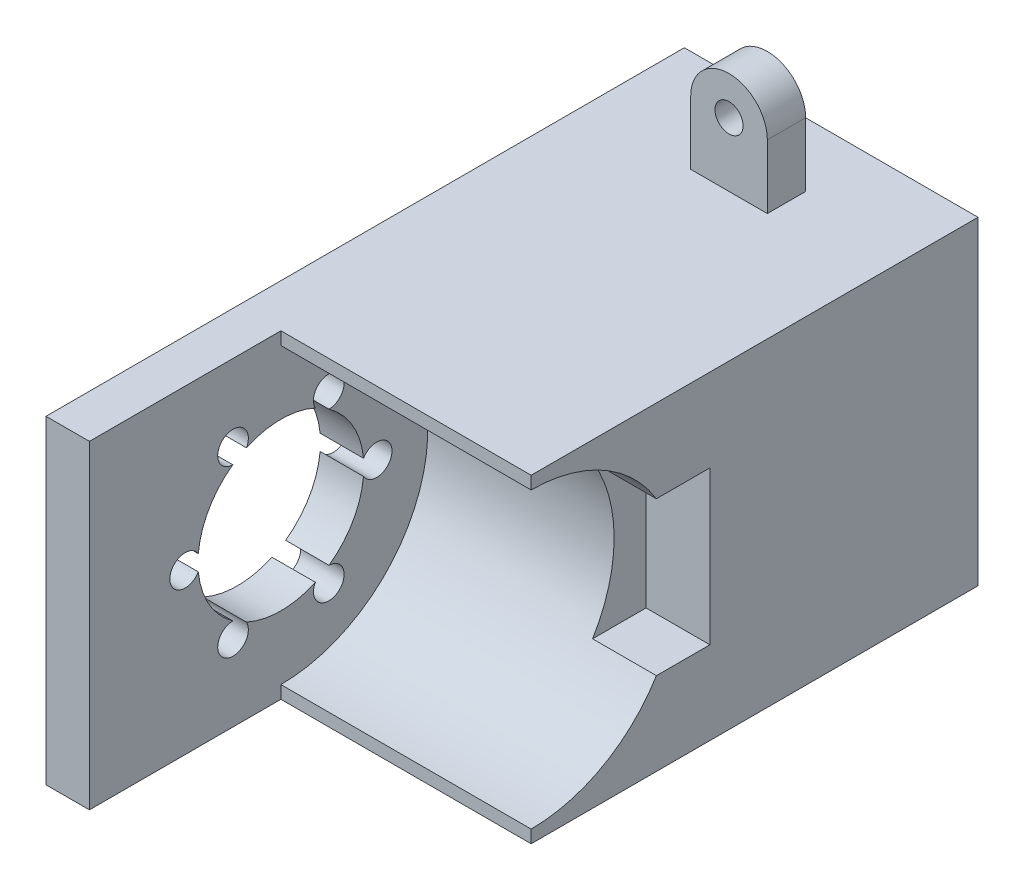
ISO-10303-21;
HEADER;
FILE_DESCRIPTION(('STEP AP214'),'2;1');
FILE_NAME('part.step','',(''),(''),'','','');
FILE_SCHEMA(('AUTOMOTIVE_DESIGN { 1 0 10303 214 1 1 1 1 }'));
ENDSEC;
DATA;
#1=APPLICATION_CONTEXT('core data for automotive mechanical design processes');
#2=APPLICATION_PROTOCOL_DEFINITION('international standard','automotive_design',2000,#1);
#3=PRODUCT_CONTEXT('',#1,'mechanical');
#4=PRODUCT('Part','Part','',(#3));
#5=PRODUCT_RELATED_PRODUCT_CATEGORY('part','',(#4));
#6=PRODUCT_DEFINITION_FORMATION('','',#4);
#7=PRODUCT_DEFINITION_CONTEXT('part definition',#1,'design');
#8=PRODUCT_DEFINITION('design','',#6,#7);
#9=PRODUCT_DEFINITION_SHAPE('','',#8);
#10=(LENGTH_UNIT() NAMED_UNIT(*) SI_UNIT(.MILLI.,.METRE.));
#11=(NAMED_UNIT(*) PLANE_ANGLE_UNIT() SI_UNIT($,.RADIAN.));
#12=(NAMED_UNIT(*) SI_UNIT($,.STERADIAN.) SOLID_ANGLE_UNIT());
#13=UNCERTAINTY_MEASURE_WITH_UNIT(LENGTH_MEASURE(1.E-05),#10,'distance_accuracy_value','');
#14=(GEOMETRIC_REPRESENTATION_CONTEXT(3) GLOBAL_UNCERTAINTY_ASSIGNED_CONTEXT((#13)) GLOBAL_UNIT_ASSIGNED_CONTEXT((#10,
#11,#12)) REPRESENTATION_CONTEXT('',''));
#15=CARTESIAN_POINT('',(0.,0.,0.));
#16=DIRECTION('',(0.,0.,1.));
#17=DIRECTION('',(1.,0.,0.));
#18=AXIS2_PLACEMENT_3D('',#15,#16,#17);
#19=CARTESIAN_POINT('',(-3.,-17.5,-27.));
#20=DIRECTION('',(-1.,0.,0.));
#21=DIRECTION('',(0.,0.,1.));
#22=AXIS2_PLACEMENT_3D('',#19,#20,#21);
#23=PLANE('',#22);
#24=DIRECTION('',(0.,0.,-1.));
#25=VECTOR('',#24,1.);
#26=CARTESIAN_POINT('',(-3.,-12.5,-27.));
#27=LINE('',#26,#25);
#28=CARTESIAN_POINT('',(-3.,-12.5,-27.));
#29=VERTEX_POINT('',#28);
#30=CARTESIAN_POINT('',(-3.,-12.5,-30.));
#31=VERTEX_POINT('',#30);
#32=EDGE_CURVE('E677',#29,#31,#27,.T.);
#33=ORIENTED_EDGE('',*,*,#32,.T.);
#34=DIRECTION('',(0.,1.,0.));
#35=VECTOR('',#34,1.);
#36=CARTESIAN_POINT('',(-3.,-17.5,-30.));
#37=LINE('',#36,#35);
#38=CARTESIAN_POINT('',(-3.,-17.5,-30.));
#39=VERTEX_POINT('',#38);
#40=EDGE_CURVE('E713',#39,#31,#37,.T.);
#41=ORIENTED_EDGE('',*,*,#40,.F.);
#42=DIRECTION('',(0.,0.,-1.));
#43=VECTOR('',#42,1.);
#44=CARTESIAN_POINT('',(-3.,-17.5,-27.));
#45=LINE('',#44,#43);
#46=CARTESIAN_POINT('',(-3.,-17.5,-27.));
#47=VERTEX_POINT('',#46);
#48=EDGE_CURVE('E673',#47,#39,#45,.T.);
#49=ORIENTED_EDGE('',*,*,#48,.F.);
#50=DIRECTION('',(0.,1.,0.));
#51=VECTOR('',#50,1.);
#52=CARTESIAN_POINT('',(-3.,-17.5,-27.));
#53=LINE('',#52,#51);
#54=EDGE_CURVE('E663',#47,#29,#53,.T.);
#55=ORIENTED_EDGE('',*,*,#54,.T.);
#56=EDGE_LOOP('',(#33,#41,#49,#55));
#57=FACE_BOUND('',#56,.T.);
#58=ADVANCED_FACE('F95',(#57),#23,.T.);
#59=CARTESIAN_POINT('',(0.,-17.5,-27.));
#60=DIRECTION('',(0.,0.,-1.));
#61=DIRECTION('',(-1.,0.,0.));
#62=AXIS2_PLACEMENT_3D('',#59,#60,#61);
#63=CYLINDRICAL_SURFACE('',#62,3.);
#64=ORIENTED_EDGE('',*,*,#48,.T.);
#65=CARTESIAN_POINT('',(0.,-17.5,-30.));
#66=DIRECTION('',(0.,0.,-1.));
#67=DIRECTION('',(-1.,0.,0.));
#68=AXIS2_PLACEMENT_3D('',#65,#66,#67);
#69=CIRCLE('',#68,3.);
#70=CARTESIAN_POINT('',(3.,-17.5,-30.));
#71=VERTEX_POINT('',#70);
#72=EDGE_CURVE('E706',#71,#39,#69,.T.);
#73=ORIENTED_EDGE('',*,*,#72,.F.);
#74=DIRECTION('',(0.,0.,-1.));
#75=VECTOR('',#74,1.);
#76=CARTESIAN_POINT('',(3.,-17.5,-27.));
#77=LINE('',#76,#75);
#78=CARTESIAN_POINT('',(3.,-17.5,-27.));
#79=VERTEX_POINT('',#78);
#80=EDGE_CURVE('E675',#79,#71,#77,.T.);
#81=ORIENTED_EDGE('',*,*,#80,.F.);
#82=CARTESIAN_POINT('',(0.,-17.5,-27.));
#83=DIRECTION('',(0.,0.,-1.));
#84=DIRECTION('',(-1.,0.,0.));
#85=AXIS2_PLACEMENT_3D('',#82,#83,#84);
#86=CIRCLE('',#85,3.);
#87=EDGE_CURVE('E666',#79,#47,#86,.T.);
#88=ORIENTED_EDGE('',*,*,#87,.T.);
#89=EDGE_LOOP('',(#64,#73,#81,#88));
#90=FACE_BOUND('',#89,.T.);
#91=ADVANCED_FACE('F553',(#90),#63,.T.);
#92=CARTESIAN_POINT('',(3.,-17.5,-27.));
#93=DIRECTION('',(1.,0.,0.));
#94=DIRECTION('',(0.,1.,0.));
#95=AXIS2_PLACEMENT_3D('',#92,#93,#94);
#96=PLANE('',#95);
#97=ORIENTED_EDGE('',*,*,#80,.T.);
#98=DIRECTION('',(0.,-1.,0.));
#99=VECTOR('',#98,1.);
#100=CARTESIAN_POINT('',(3.,-17.5,-30.));
#101=LINE('',#100,#99);
#102=CARTESIAN_POINT('',(3.,-12.5,-30.));
#103=VERTEX_POINT('',#102);
#104=EDGE_CURVE('E716',#103,#71,#101,.T.);
#105=ORIENTED_EDGE('',*,*,#104,.F.);
#106=DIRECTION('',(0.,0.,-1.));
#107=VECTOR('',#106,1.);
#108=CARTESIAN_POINT('',(3.,-12.5,-27.));
#109=LINE('',#108,#107);
#110=CARTESIAN_POINT('',(3.,-12.5,-27.));
#111=VERTEX_POINT('',#110);
#112=EDGE_CURVE('E680',#111,#103,#109,.T.);
#113=ORIENTED_EDGE('',*,*,#112,.F.);
#114=DIRECTION('',(0.,-1.,0.));
#115=VECTOR('',#114,1.);
#116=CARTESIAN_POINT('',(3.,-17.5,-27.));
#117=LINE('',#116,#115);
#118=EDGE_CURVE('E678',#111,#79,#117,.T.);
#119=ORIENTED_EDGE('',*,*,#118,.T.);
#120=EDGE_LOOP('',(#97,#105,#113,#119));
#121=FACE_BOUND('',#120,.T.);
#122=ADVANCED_FACE('F559',(#121),#96,.T.);
#123=CARTESIAN_POINT('',(0.,-17.5,-27.));
#124=DIRECTION('',(0.,0.,-1.));
#125=DIRECTION('',(-1.,0.,0.));
#126=AXIS2_PLACEMENT_3D('',#123,#124,#125);
#127=CYLINDRICAL_SURFACE('',#126,1.1);
#128=CARTESIAN_POINT('',(0.,-17.5,-27.));
#129=DIRECTION('',(0.,0.,-1.));
#130=DIRECTION('',(-1.,0.,0.));
#131=AXIS2_PLACEMENT_3D('',#128,#129,#130);
#132=CIRCLE('',#131,1.1);
#133=CARTESIAN_POINT('',(-1.1,-17.5,-27.));
#134=VERTEX_POINT('',#133);
#135=EDGE_CURVE('E659',#134,#134,#132,.T.);
#136=ORIENTED_EDGE('',*,*,#135,.F.);
#137=EDGE_LOOP('',(#136));
#138=FACE_BOUND('',#137,.T.);
#139=CARTESIAN_POINT('',(0.,-17.5,-30.));
#140=DIRECTION('',(0.,0.,-1.));
#141=DIRECTION('',(-1.,0.,0.));
#142=AXIS2_PLACEMENT_3D('',#139,#140,#141);
#143=CIRCLE('',#142,1.1);
#144=CARTESIAN_POINT('',(-1.1,-17.5,-30.));
#145=VERTEX_POINT('',#144);
#146=EDGE_CURVE('E710',#145,#145,#143,.T.);
#147=ORIENTED_EDGE('',*,*,#146,.T.);
#148=EDGE_LOOP('',(#147));
#149=FACE_BOUND('',#148,.T.);
#150=ADVANCED_FACE('F635',(#138,#149),#127,.F.);
#151=CARTESIAN_POINT('',(0.,12.5,-35.));
#152=DIRECTION('',(0.,-1.,0.));
#153=DIRECTION('',(0.,0.,-1.));
#154=AXIS2_PLACEMENT_3D('',#151,#152,#153);
#155=PLANE('',#154);
#156=DIRECTION('',(0.,0.,1.));
#157=VECTOR('',#156,1.);
#158=CARTESIAN_POINT('',(11.5,12.5,-35.));
#159=LINE('',#158,#157);
#160=CARTESIAN_POINT('',(11.5,12.5,-35.));
#161=VERTEX_POINT('',#160);
#162=CARTESIAN_POINT('',(11.5,12.5,0.));
#163=VERTEX_POINT('',#162);
#164=EDGE_CURVE('E461',#161,#163,#159,.T.);
#165=ORIENTED_EDGE('',*,*,#164,.F.);
#166=DIRECTION('',(1.,0.,0.));
#167=VECTOR('',#166,1.);
#168=CARTESIAN_POINT('',(0.,12.5,-35.));
#169=LINE('',#168,#167);
#170=CARTESIAN_POINT('',(-11.5,12.5,-35.));
#171=VERTEX_POINT('',#170);
#172=EDGE_CURVE('E453',#171,#161,#169,.T.);
#173=ORIENTED_EDGE('',*,*,#172,.F.);
#174=DIRECTION('',(0.,0.,1.));
#175=VECTOR('',#174,1.);
#176=CARTESIAN_POINT('',(-11.5,12.5,-35.));
#177=LINE('',#176,#175);
#178=CARTESIAN_POINT('',(-11.5,12.5,15.));
#179=VERTEX_POINT('',#178);
#180=EDGE_CURVE('E474',#171,#179,#177,.T.);
#181=ORIENTED_EDGE('',*,*,#180,.T.);
#182=DIRECTION('',(-1.,0.,0.));
#183=VECTOR('',#182,1.);
#184=CARTESIAN_POINT('',(-11.5,12.5,15.));
#185=LINE('',#184,#183);
#186=CARTESIAN_POINT('',(-8.10000000000001,12.5,15.));
#187=VERTEX_POINT('',#186);
#188=EDGE_CURVE('E423',#187,#179,#185,.T.);
#189=ORIENTED_EDGE('',*,*,#188,.F.);
#190=DIRECTION('',(0.,0.,-1.));
#191=VECTOR('',#190,1.);
#192=CARTESIAN_POINT('',(-8.10000000000001,12.5,15.));
#193=LINE('',#192,#191);
#194=CARTESIAN_POINT('',(-8.1,12.5,0.));
#195=VERTEX_POINT('',#194);
#196=EDGE_CURVE('E434',#187,#195,#193,.T.);
#197=ORIENTED_EDGE('',*,*,#196,.T.);
#198=DIRECTION('',(1.,0.,0.));
#199=VECTOR('',#198,1.);
#200=CARTESIAN_POINT('',(0.,12.5,0.));
#201=LINE('',#200,#199);
#202=EDGE_CURVE('E465',#195,#163,#201,.T.);
#203=ORIENTED_EDGE('',*,*,#202,.T.);
#204=EDGE_LOOP('',(#165,#173,#181,#189,#197,#203));
#205=FACE_BOUND('',#204,.T.);
#206=DIRECTION('',(0.,0.,-1.));
#207=VECTOR('',#206,1.);
#208=CARTESIAN_POINT('',(3.,12.5,-27.));
#209=LINE('',#208,#207);
#210=CARTESIAN_POINT('',(3.,12.5,-27.));
#211=VERTEX_POINT('',#210);
#212=CARTESIAN_POINT('',(3.,12.5,-30.));
#213=VERTEX_POINT('',#212);
#214=EDGE_CURVE('E308',#211,#213,#209,.T.);
#215=ORIENTED_EDGE('',*,*,#214,.F.);
#216=DIRECTION('',(-1.,0.,0.));
#217=VECTOR('',#216,1.);
#218=CARTESIAN_POINT('',(3.,12.5,-27.));
#219=LINE('',#218,#217);
#220=CARTESIAN_POINT('',(-3.,12.5,-27.));
#221=VERTEX_POINT('',#220);
#222=EDGE_CURVE('E696',#211,#221,#219,.T.);
#223=ORIENTED_EDGE('',*,*,#222,.T.);
#224=DIRECTION('',(0.,0.,-1.));
#225=VECTOR('',#224,1.);
#226=CARTESIAN_POINT('',(-3.,12.5,-27.));
#227=LINE('',#226,#225);
#228=CARTESIAN_POINT('',(-3.,12.5,-30.));
#229=VERTEX_POINT('',#228);
#230=EDGE_CURVE('E309',#221,#229,#227,.T.);
#231=ORIENTED_EDGE('',*,*,#230,.T.);
#232=DIRECTION('',(-1.,0.,0.));
#233=VECTOR('',#232,1.);
#234=CARTESIAN_POINT('',(3.,12.5,-30.));
#235=LINE('',#234,#233);
#236=EDGE_CURVE('E304',#213,#229,#235,.T.);
#237=ORIENTED_EDGE('',*,*,#236,.F.);
#238=EDGE_LOOP('',(#215,#223,#231,#237));
#239=FACE_BOUND('',#238,.T.);
#240=ADVANCED_FACE('F305',(#205,#239),#155,.F.);
#241=CARTESIAN_POINT('',(0.,0.,0.));
#242=DIRECTION('',(0.,0.,1.));
#243=DIRECTION('',(1.,0.,0.));
#244=AXIS2_PLACEMENT_3D('',#241,#242,#243);
#245=PLANE('',#244);
#246=ORIENTED_EDGE('',*,*,#202,.F.);
#247=DIRECTION('',(0.,1.,0.));
#248=VECTOR('',#247,1.);
#249=CARTESIAN_POINT('',(-8.10000000000001,12.5,0.));
#250=LINE('',#249,#248);
#251=CARTESIAN_POINT('',(-8.10000000000001,11.5,0.));
#252=VERTEX_POINT('',#251);
#253=EDGE_CURVE('E422',#252,#195,#250,.T.);
#254=ORIENTED_EDGE('',*,*,#253,.F.);
#255=DIRECTION('',(1.,0.,0.));
#256=VECTOR('',#255,1.);
#257=CARTESIAN_POINT('',(11.5,11.5,0.));
#258=LINE('',#257,#256);
#259=CARTESIAN_POINT('',(11.5,11.5,0.));
#260=VERTEX_POINT('',#259);
#261=EDGE_CURVE('E471',#252,#260,#258,.T.);
#262=ORIENTED_EDGE('',*,*,#261,.T.);
#263=DIRECTION('',(0.,-1.,0.));
#264=VECTOR('',#263,1.);
#265=CARTESIAN_POINT('',(11.5,0.,0.));
#266=LINE('',#265,#264);
#267=EDGE_CURVE('E462',#163,#260,#266,.T.);
#268=ORIENTED_EDGE('',*,*,#267,.F.);
#269=EDGE_LOOP('',(#246,#254,#262,#268));
#270=FACE_BOUND('',#269,.T.);
#271=ADVANCED_FACE('F510',(#270),#245,.T.);
#272=DIRECTION('',(1.,0.,0.));
#273=VECTOR('',#272,1.);
#274=CARTESIAN_POINT('',(11.5,-11.5,0.));
#275=LINE('',#274,#273);
#276=CARTESIAN_POINT('',(11.5,-11.5,0.));
#277=VERTEX_POINT('',#276);
#278=CARTESIAN_POINT('',(-8.1,-11.5,0.));
#279=VERTEX_POINT('',#278);
#280=EDGE_CURVE('E480',#277,#279,#275,.F.);
#281=ORIENTED_EDGE('',*,*,#280,.T.);
#282=CARTESIAN_POINT('',(-8.1,-12.5,0.));
#283=VERTEX_POINT('',#282);
#284=EDGE_CURVE('E427',#283,#279,#250,.T.);
#285=ORIENTED_EDGE('',*,*,#284,.F.);
#286=DIRECTION('',(1.,0.,0.));
#287=VECTOR('',#286,1.);
#288=CARTESIAN_POINT('',(0.,-12.5,0.));
#289=LINE('',#288,#287);
#290=CARTESIAN_POINT('',(11.5,-12.5,0.));
#291=VERTEX_POINT('',#290);
#292=EDGE_CURVE('E454',#283,#291,#289,.T.);
#293=ORIENTED_EDGE('',*,*,#292,.T.);
#294=EDGE_CURVE('E449',#277,#291,#266,.T.);
#295=ORIENTED_EDGE('',*,*,#294,.F.);
#296=EDGE_LOOP('',(#281,#285,#293,#295));
#297=FACE_BOUND('',#296,.T.);
#298=ADVANCED_FACE('F533',(#297),#245,.T.);
#299=CARTESIAN_POINT('',(11.5,0.,-35.));
#300=DIRECTION('',(-1.,0.,0.));
#301=DIRECTION('',(0.,0.,1.));
#302=AXIS2_PLACEMENT_3D('',#299,#300,#301);
#303=PLANE('',#302);
#304=DIRECTION('',(0.,1.,0.));
#305=VECTOR('',#304,1.);
#306=CARTESIAN_POINT('',(11.5,-6.,-14.));
#307=LINE('',#306,#305);
#308=CARTESIAN_POINT('',(11.5,-6.,-14.));
#309=VERTEX_POINT('',#308);
#310=CARTESIAN_POINT('',(11.5,6.,-14.));
#311=VERTEX_POINT('',#310);
#312=EDGE_CURVE('E339',#309,#311,#307,.T.);
#313=ORIENTED_EDGE('',*,*,#312,.F.);
#314=DIRECTION('',(0.,0.,-1.));
#315=VECTOR('',#314,1.);
#316=CARTESIAN_POINT('',(11.5,-6.,-8.99999999999999));
#317=LINE('',#316,#315);
#318=CARTESIAN_POINT('',(11.5,-6.,-9.81070843517429));
#319=VERTEX_POINT('',#318);
#320=EDGE_CURVE('E334',#319,#309,#317,.T.);
#321=ORIENTED_EDGE('',*,*,#320,.F.);
#322=CARTESIAN_POINT('',(11.5,0.,0.));
#323=DIRECTION('',(1.,0.,0.));
#324=DIRECTION('',(0.,0.,-1.));
#325=AXIS2_PLACEMENT_3D('',#322,#323,#324);
#326=CIRCLE('',#325,11.5);
#327=EDGE_CURVE('E446',#277,#319,#326,.T.);
#328=ORIENTED_EDGE('',*,*,#327,.F.);
#329=ORIENTED_EDGE('',*,*,#294,.T.);
#330=DIRECTION('',(0.,0.,1.));
#331=VECTOR('',#330,1.);
#332=CARTESIAN_POINT('',(11.5,-12.5,-35.));
#333=LINE('',#332,#331);
#334=CARTESIAN_POINT('',(11.5,-12.5,-35.));
#335=VERTEX_POINT('',#334);
#336=EDGE_CURVE('E468',#335,#291,#333,.T.);
#337=ORIENTED_EDGE('',*,*,#336,.F.);
#338=DIRECTION('',(0.,-1.,0.));
#339=VECTOR('',#338,1.);
#340=CARTESIAN_POINT('',(11.5,0.,-35.));
#341=LINE('',#340,#339);
#342=EDGE_CURVE('E450',#161,#335,#341,.T.);
#343=ORIENTED_EDGE('',*,*,#342,.F.);
#344=ORIENTED_EDGE('',*,*,#164,.T.);
#345=ORIENTED_EDGE('',*,*,#267,.T.);
#346=CARTESIAN_POINT('',(11.5,6.,-9.81070843517429));
#347=VERTEX_POINT('',#346);
#348=EDGE_CURVE('E445',#347,#260,#326,.T.);
#349=ORIENTED_EDGE('',*,*,#348,.F.);
#350=DIRECTION('',(0.,0.,1.));
#351=VECTOR('',#350,1.);
#352=CARTESIAN_POINT('',(11.5,6.,-9.));
#353=LINE('',#352,#351);
#354=EDGE_CURVE('E342',#311,#347,#353,.T.);
#355=ORIENTED_EDGE('',*,*,#354,.F.);
#356=EDGE_LOOP('',(#313,#321,#328,#329,#337,#343,#344,#345,#349,#355));
#357=FACE_BOUND('',#356,.T.);
#358=ADVANCED_FACE('F97',(#357),#303,.F.);
#359=CARTESIAN_POINT('',(0.,-12.5,-35.));
#360=DIRECTION('',(0.,-1.,0.));
#361=DIRECTION('',(0.,0.,-1.));
#362=AXIS2_PLACEMENT_3D('',#359,#360,#361);
#363=PLANE('',#362);
#364=DIRECTION('',(1.,0.,0.));
#365=VECTOR('',#364,1.);
#366=CARTESIAN_POINT('',(0.,-12.5,-35.));
#367=LINE('',#366,#365);
#368=CARTESIAN_POINT('',(-11.5,-12.5,-35.));
#369=VERTEX_POINT('',#368);
#370=EDGE_CURVE('E459',#369,#335,#367,.T.);
#371=ORIENTED_EDGE('',*,*,#370,.T.);
#372=ORIENTED_EDGE('',*,*,#336,.T.);
#373=ORIENTED_EDGE('',*,*,#292,.F.);
#374=DIRECTION('',(0.,0.,-1.));
#375=VECTOR('',#374,1.);
#376=CARTESIAN_POINT('',(-8.1,-12.5,15.));
#377=LINE('',#376,#375);
#378=CARTESIAN_POINT('',(-8.1,-12.5,15.));
#379=VERTEX_POINT('',#378);
#380=EDGE_CURVE('E439',#379,#283,#377,.T.);
#381=ORIENTED_EDGE('',*,*,#380,.F.);
#382=DIRECTION('',(1.,0.,0.));
#383=VECTOR('',#382,1.);
#384=CARTESIAN_POINT('',(-8.1,-12.5,15.));
#385=LINE('',#384,#383);
#386=CARTESIAN_POINT('',(-11.5,-12.5,15.));
#387=VERTEX_POINT('',#386);
#388=EDGE_CURVE('E430',#387,#379,#385,.T.);
#389=ORIENTED_EDGE('',*,*,#388,.F.);
#390=DIRECTION('',(0.,0.,1.));
#391=VECTOR('',#390,1.);
#392=CARTESIAN_POINT('',(-11.5,-12.5,-35.));
#393=LINE('',#392,#391);
#394=EDGE_CURVE('E472',#369,#387,#393,.T.);
#395=ORIENTED_EDGE('',*,*,#394,.F.);
#396=EDGE_LOOP('',(#371,#372,#373,#381,#389,#395));
#397=FACE_BOUND('',#396,.T.);
#398=ORIENTED_EDGE('',*,*,#32,.F.);
#399=DIRECTION('',(1.,0.,0.));
#400=VECTOR('',#399,1.);
#401=CARTESIAN_POINT('',(3.,-12.5,-27.));
#402=LINE('',#401,#400);
#403=EDGE_CURVE('E668',#29,#111,#402,.T.);
#404=ORIENTED_EDGE('',*,*,#403,.T.);
#405=ORIENTED_EDGE('',*,*,#112,.T.);
#406=DIRECTION('',(1.,0.,0.));
#407=VECTOR('',#406,1.);
#408=CARTESIAN_POINT('',(3.,-12.5,-30.));
#409=LINE('',#408,#407);
#410=EDGE_CURVE('E118',#31,#103,#409,.T.);
#411=ORIENTED_EDGE('',*,*,#410,.F.);
#412=EDGE_LOOP('',(#398,#404,#405,#411));
#413=FACE_BOUND('',#412,.T.);
#414=ADVANCED_FACE('F527',(#397,#413),#363,.T.);
#415=CARTESIAN_POINT('',(-11.5,0.,-35.));
#416=DIRECTION('',(-1.,0.,0.));
#417=DIRECTION('',(0.,0.,1.));
#418=AXIS2_PLACEMENT_3D('',#415,#416,#417);
#419=PLANE('',#418);
#420=CARTESIAN_POINT('',(-11.5,0.,0.));
#421=DIRECTION('',(-1.,0.,0.));
#422=DIRECTION('',(0.,0.,1.));
#423=AXIS2_PLACEMENT_3D('',#420,#421,#422);
#424=CIRCLE('',#423,6.5);
#425=CARTESIAN_POINT('',(-11.5,0.616824844578213,6.47066666666666));
#426=VERTEX_POINT('',#425);
#427=CARTESIAN_POINT('',(-11.5,5.29534929046546,3.76951931842337));
#428=VERTEX_POINT('',#427);
#429=EDGE_CURVE('E403',#426,#428,#424,.T.);
#430=ORIENTED_EDGE('',*,*,#429,.F.);
#431=CARTESIAN_POINT('',(-11.5,0.,7.5));
#432=DIRECTION('',(-1.,0.,0.));
#433=DIRECTION('',(0.,0.,1.));
#434=AXIS2_PLACEMENT_3D('',#431,#432,#433);
#435=CIRCLE('',#434,1.2);
#436=CARTESIAN_POINT('',(-11.5,-0.616824844578123,6.47066666666667));
#437=VERTEX_POINT('',#436);
#438=EDGE_CURVE('E409',#437,#426,#435,.T.);
#439=ORIENTED_EDGE('',*,*,#438,.F.);
#440=CARTESIAN_POINT('',(-11.5,0.,0.));
#441=DIRECTION('',(-1.,0.,0.));
#442=DIRECTION('',(0.,0.,1.));
#443=AXIS2_PLACEMENT_3D('',#440,#441,#442);
#444=CIRCLE('',#443,6.5);
#445=CARTESIAN_POINT('',(-11.5,-5.29534929046541,3.76951931842344));
#446=VERTEX_POINT('',#445);
#447=EDGE_CURVE('E405',#446,#437,#444,.T.);
#448=ORIENTED_EDGE('',*,*,#447,.F.);
#449=CARTESIAN_POINT('',(-11.5,-6.49519052838327,3.75000000000003));
#450=DIRECTION('',(-1.,0.,0.));
#451=DIRECTION('',(0.,0.,1.));
#452=AXIS2_PLACEMENT_3D('',#449,#450,#451);
#453=CIRCLE('',#452,1.2);
#454=CARTESIAN_POINT('',(-11.5,-5.91217413504358,2.70114734824327));
#455=VERTEX_POINT('',#454);
#456=EDGE_CURVE('E418',#455,#446,#453,.T.);
#457=ORIENTED_EDGE('',*,*,#456,.F.);
#458=CARTESIAN_POINT('',(-11.5,0.,0.));
#459=DIRECTION('',(-1.,0.,0.));
#460=DIRECTION('',(0.,0.,1.));
#461=AXIS2_PLACEMENT_3D('',#458,#459,#460);
#462=CIRCLE('',#461,6.5);
#463=CARTESIAN_POINT('',(-11.5,-5.91217413504364,-2.70114734824315));
#464=VERTEX_POINT('',#463);
#465=EDGE_CURVE('E407',#464,#455,#462,.T.);
#466=ORIENTED_EDGE('',*,*,#465,.F.);
#467=CARTESIAN_POINT('',(-11.5,-6.49519052838335,-3.74999999999989));
#468=DIRECTION('',(-1.,0.,0.));
#469=DIRECTION('',(0.,0.,1.));
#470=AXIS2_PLACEMENT_3D('',#467,#468,#469);
#471=CIRCLE('',#470,1.2);
#472=CARTESIAN_POINT('',(-11.5,-5.29534929046548,-3.76951931842333));
#473=VERTEX_POINT('',#472);
#474=EDGE_CURVE('E413',#473,#464,#471,.T.);
#475=ORIENTED_EDGE('',*,*,#474,.F.);
#476=CARTESIAN_POINT('',(-11.5,0.,0.));
#477=DIRECTION('',(-1.,0.,0.));
#478=DIRECTION('',(0.,0.,1.));
#479=AXIS2_PLACEMENT_3D('',#476,#477,#478);
#480=CIRCLE('',#479,6.5);
#481=CARTESIAN_POINT('',(-11.5,-0.616824844578176,-6.47066666666667));
#482=VERTEX_POINT('',#481);
#483=EDGE_CURVE('E357',#482,#473,#480,.T.);
#484=ORIENTED_EDGE('',*,*,#483,.F.);
#485=CARTESIAN_POINT('',(-11.5,0.,-7.5));
#486=DIRECTION('',(-1.,0.,0.));
#487=DIRECTION('',(0.,0.,1.));
#488=AXIS2_PLACEMENT_3D('',#485,#486,#487);
#489=CIRCLE('',#488,1.2);
#490=CARTESIAN_POINT('',(-11.5,0.616824844578176,-6.47066666666667));
#491=VERTEX_POINT('',#490);
#492=EDGE_CURVE('E415',#491,#482,#489,.T.);
#493=ORIENTED_EDGE('',*,*,#492,.F.);
#494=CARTESIAN_POINT('',(-11.5,0.,0.));
#495=DIRECTION('',(-1.,0.,0.));
#496=DIRECTION('',(0.,0.,1.));
#497=AXIS2_PLACEMENT_3D('',#494,#495,#496);
#498=CIRCLE('',#497,6.5);
#499=CARTESIAN_POINT('',(-11.5,5.29534929046538,-3.76951931842348));
#500=VERTEX_POINT('',#499);
#501=EDGE_CURVE('E399',#500,#491,#498,.T.);
#502=ORIENTED_EDGE('',*,*,#501,.F.);
#503=CARTESIAN_POINT('',(-11.5,6.49519052838325,-3.75000000000008));
#504=DIRECTION('',(-1.,0.,0.));
#505=DIRECTION('',(0.,0.,1.));
#506=AXIS2_PLACEMENT_3D('',#503,#504,#505);
#507=CIRCLE('',#506,1.2);
#508=CARTESIAN_POINT('',(-11.5,5.91217413504356,-2.70114734824332));
#509=VERTEX_POINT('',#508);
#510=EDGE_CURVE('E411',#509,#500,#507,.T.);
#511=ORIENTED_EDGE('',*,*,#510,.F.);
#512=CARTESIAN_POINT('',(-11.5,0.,0.));
#513=DIRECTION('',(-1.,0.,0.));
#514=DIRECTION('',(0.,0.,1.));
#515=AXIS2_PLACEMENT_3D('',#512,#513,#514);
#516=CIRCLE('',#515,6.5);
#517=CARTESIAN_POINT('',(-11.5,5.91217413504362,2.7011473482432));
#518=VERTEX_POINT('',#517);
#519=EDGE_CURVE('E401',#518,#509,#516,.T.);
#520=ORIENTED_EDGE('',*,*,#519,.F.);
#521=CARTESIAN_POINT('',(-11.5,6.49519052838333,3.74999999999994));
#522=DIRECTION('',(-1.,0.,0.));
#523=DIRECTION('',(0.,0.,1.));
#524=AXIS2_PLACEMENT_3D('',#521,#522,#523);
#525=CIRCLE('',#524,1.2);
#526=EDGE_CURVE('E420',#428,#518,#525,.T.);
#527=ORIENTED_EDGE('',*,*,#526,.F.);
#528=EDGE_LOOP('',(#430,#439,#448,#457,#466,#475,#484,#493,#502,#511,#520,#527));
#529=FACE_BOUND('',#528,.T.);
#530=ORIENTED_EDGE('',*,*,#394,.T.);
#531=DIRECTION('',(0.,-1.,0.));
#532=VECTOR('',#531,1.);
#533=CARTESIAN_POINT('',(-11.5,-12.5,15.));
#534=LINE('',#533,#532);
#535=EDGE_CURVE('E426',#179,#387,#534,.T.);
#536=ORIENTED_EDGE('',*,*,#535,.F.);
#537=ORIENTED_EDGE('',*,*,#180,.F.);
#538=DIRECTION('',(0.,-1.,0.));
#539=VECTOR('',#538,1.);
#540=CARTESIAN_POINT('',(-11.5,0.,-35.));
#541=LINE('',#540,#539);
#542=EDGE_CURVE('E456',#171,#369,#541,.T.);
#543=ORIENTED_EDGE('',*,*,#542,.T.);
#544=EDGE_LOOP('',(#530,#536,#537,#543));
#545=FACE_BOUND('',#544,.T.);
#546=ADVANCED_FACE('F541',(#529,#545),#419,.T.);
#547=CARTESIAN_POINT('',(0.,0.,-35.));
#548=DIRECTION('',(0.,0.,1.));
#549=DIRECTION('',(1.,0.,0.));
#550=AXIS2_PLACEMENT_3D('',#547,#548,#549);
#551=PLANE('',#550);
#552=ORIENTED_EDGE('',*,*,#172,.T.);
#553=ORIENTED_EDGE('',*,*,#342,.T.);
#554=ORIENTED_EDGE('',*,*,#370,.F.);
#555=ORIENTED_EDGE('',*,*,#542,.F.);
#556=EDGE_LOOP('',(#552,#553,#554,#555));
#557=FACE_BOUND('',#556,.T.);
#558=ADVANCED_FACE('F538',(#557),#551,.F.);
#559=CARTESIAN_POINT('',(11.5,0.,0.));
#560=DIRECTION('',(1.,0.,0.));
#561=DIRECTION('',(0.,0.,-1.));
#562=AXIS2_PLACEMENT_3D('',#559,#560,#561);
#563=CYLINDRICAL_SURFACE('',#562,11.5);
#564=DIRECTION('',(1.,0.,0.));
#565=VECTOR('',#564,1.);
#566=CARTESIAN_POINT('',(11.5,-6.,-9.81070843517429));
#567=LINE('',#566,#565);
#568=CARTESIAN_POINT('',(6.5,-6.,-9.81070843517429));
#569=VERTEX_POINT('',#568);
#570=EDGE_CURVE('E12',#569,#319,#567,.T.);
#571=ORIENTED_EDGE('',*,*,#570,.F.);
#572=CARTESIAN_POINT('',(6.5,0.,0.));
#573=DIRECTION('',(-1.,0.,0.));
#574=DIRECTION('',(0.,0.,1.));
#575=AXIS2_PLACEMENT_3D('',#572,#573,#574);
#576=CIRCLE('',#575,11.5);
#577=CARTESIAN_POINT('',(6.5,6.,-9.81070843517429));
#578=VERTEX_POINT('',#577);
#579=EDGE_CURVE('E483',#578,#569,#576,.T.);
#580=ORIENTED_EDGE('',*,*,#579,.F.);
#581=DIRECTION('',(1.,0.,0.));
#582=VECTOR('',#581,1.);
#583=CARTESIAN_POINT('',(11.5,6.,-9.81070843517429));
#584=LINE('',#583,#582);
#585=EDGE_CURVE('E103',#347,#578,#584,.F.);
#586=ORIENTED_EDGE('',*,*,#585,.F.);
#587=ORIENTED_EDGE('',*,*,#348,.T.);
#588=ORIENTED_EDGE('',*,*,#261,.F.);
#589=CARTESIAN_POINT('',(-8.1,0.,0.));
#590=DIRECTION('',(1.,0.,0.));
#591=DIRECTION('',(0.,0.,-1.));
#592=AXIS2_PLACEMENT_3D('',#589,#590,#591);
#593=CIRCLE('',#592,11.5);
#594=EDGE_CURVE('E442',#279,#252,#593,.T.);
#595=ORIENTED_EDGE('',*,*,#594,.F.);
#596=ORIENTED_EDGE('',*,*,#280,.F.);
#597=ORIENTED_EDGE('',*,*,#327,.T.);
#598=EDGE_LOOP('',(#571,#580,#586,#587,#588,#595,#596,#597));
#599=FACE_BOUND('',#598,.T.);
#600=ADVANCED_FACE('F494',(#599),#563,.F.);
#601=CARTESIAN_POINT('',(-8.1,-11.5,0.));
#602=DIRECTION('',(1.,0.,0.));
#603=DIRECTION('',(0.,0.,-1.));
#604=AXIS2_PLACEMENT_3D('',#601,#602,#603);
#605=PLANE('',#604);
#606=CARTESIAN_POINT('',(-8.1,0.,0.));
#607=DIRECTION('',(1.,0.,0.));
#608=DIRECTION('',(0.,0.,-1.));
#609=AXIS2_PLACEMENT_3D('',#606,#607,#608);
#610=CIRCLE('',#609,6.5);
#611=CARTESIAN_POINT('',(-8.1,5.29534929046546,3.76951931842337));
#612=VERTEX_POINT('',#611);
#613=CARTESIAN_POINT('',(-8.1,0.616824844578213,6.47066666666666));
#614=VERTEX_POINT('',#613);
#615=EDGE_CURVE('E397',#612,#614,#610,.T.);
#616=ORIENTED_EDGE('',*,*,#615,.F.);
#617=CARTESIAN_POINT('',(-8.1,6.49519052838333,3.74999999999994));
#618=DIRECTION('',(1.,0.,0.));
#619=DIRECTION('',(0.,0.,-1.));
#620=AXIS2_PLACEMENT_3D('',#617,#618,#619);
#621=CIRCLE('',#620,1.2);
#622=CARTESIAN_POINT('',(-8.1,5.91217413504362,2.7011473482432));
#623=VERTEX_POINT('',#622);
#624=EDGE_CURVE('E350',#623,#612,#621,.T.);
#625=ORIENTED_EDGE('',*,*,#624,.F.);
#626=CARTESIAN_POINT('',(-8.1,5.91217413504356,-2.70114734824332));
#627=VERTEX_POINT('',#626);
#628=EDGE_CURVE('E994',#627,#623,#610,.T.);
#629=ORIENTED_EDGE('',*,*,#628,.F.);
#630=CARTESIAN_POINT('',(-8.1,6.49519052838325,-3.75000000000008));
#631=DIRECTION('',(1.,0.,0.));
#632=DIRECTION('',(0.,0.,-1.));
#633=AXIS2_PLACEMENT_3D('',#630,#631,#632);
#634=CIRCLE('',#633,1.2);
#635=CARTESIAN_POINT('',(-8.1,5.29534929046538,-3.76951931842348));
#636=VERTEX_POINT('',#635);
#637=EDGE_CURVE('E366',#636,#627,#634,.T.);
#638=ORIENTED_EDGE('',*,*,#637,.F.);
#639=CARTESIAN_POINT('',(-8.1,0.616824844578176,-6.47066666666667));
#640=VERTEX_POINT('',#639);
#641=EDGE_CURVE('E396',#640,#636,#610,.T.);
#642=ORIENTED_EDGE('',*,*,#641,.F.);
#643=CARTESIAN_POINT('',(-8.1,0.,-7.5));
#644=DIRECTION('',(1.,0.,0.));
#645=DIRECTION('',(0.,0.,-1.));
#646=AXIS2_PLACEMENT_3D('',#643,#644,#645);
#647=CIRCLE('',#646,1.2);
#648=CARTESIAN_POINT('',(-8.1,-0.616824844578176,-6.47066666666667));
#649=VERTEX_POINT('',#648);
#650=EDGE_CURVE('E373',#649,#640,#647,.T.);
#651=ORIENTED_EDGE('',*,*,#650,.F.);
#652=CARTESIAN_POINT('',(-8.1,-5.29534929046548,-3.76951931842333));
#653=VERTEX_POINT('',#652);
#654=EDGE_CURVE('E390',#653,#649,#610,.T.);
#655=ORIENTED_EDGE('',*,*,#654,.F.);
#656=CARTESIAN_POINT('',(-8.1,-6.49519052838335,-3.74999999999989));
#657=DIRECTION('',(1.,0.,0.));
#658=DIRECTION('',(0.,0.,-1.));
#659=AXIS2_PLACEMENT_3D('',#656,#657,#658);
#660=CIRCLE('',#659,1.2);
#661=CARTESIAN_POINT('',(-8.1,-5.91217413504364,-2.70114734824315));
#662=VERTEX_POINT('',#661);
#663=EDGE_CURVE('E387',#662,#653,#660,.T.);
#664=ORIENTED_EDGE('',*,*,#663,.F.);
#665=CARTESIAN_POINT('',(-8.1,-5.91217413504358,2.70114734824327));
#666=VERTEX_POINT('',#665);
#667=EDGE_CURVE('E348',#666,#662,#610,.T.);
#668=ORIENTED_EDGE('',*,*,#667,.F.);
#669=CARTESIAN_POINT('',(-8.1,-6.49519052838327,3.75000000000003));
#670=DIRECTION('',(1.,0.,0.));
#671=DIRECTION('',(0.,0.,-1.));
#672=AXIS2_PLACEMENT_3D('',#669,#670,#671);
#673=CIRCLE('',#672,1.2);
#674=CARTESIAN_POINT('',(-8.1,-5.29534929046541,3.76951931842344));
#675=VERTEX_POINT('',#674);
#676=EDGE_CURVE('E380',#675,#666,#673,.T.);
#677=ORIENTED_EDGE('',*,*,#676,.F.);
#678=CARTESIAN_POINT('',(-8.1,-0.616824844578123,6.47066666666667));
#679=VERTEX_POINT('',#678);
#680=EDGE_CURVE('E995',#679,#675,#610,.T.);
#681=ORIENTED_EDGE('',*,*,#680,.F.);
#682=CARTESIAN_POINT('',(-8.1,0.,7.5));
#683=DIRECTION('',(1.,0.,0.));
#684=DIRECTION('',(0.,0.,-1.));
#685=AXIS2_PLACEMENT_3D('',#682,#683,#684);
#686=CIRCLE('',#685,1.2);
#687=EDGE_CURVE('E359',#614,#679,#686,.T.);
#688=ORIENTED_EDGE('',*,*,#687,.F.);
#689=EDGE_LOOP('',(#616,#625,#629,#638,#642,#651,#655,#664,#668,#677,#681,#688));
#690=FACE_BOUND('',#689,.T.);
#691=ORIENTED_EDGE('',*,*,#594,.T.);
#692=ORIENTED_EDGE('',*,*,#253,.T.);
#693=ORIENTED_EDGE('',*,*,#196,.F.);
#694=DIRECTION('',(0.,1.,0.));
#695=VECTOR('',#694,1.);
#696=CARTESIAN_POINT('',(-8.10000000000001,12.5,15.));
#697=LINE('',#696,#695);
#698=EDGE_CURVE('E432',#379,#187,#697,.T.);
#699=ORIENTED_EDGE('',*,*,#698,.F.);
#700=ORIENTED_EDGE('',*,*,#380,.T.);
#701=ORIENTED_EDGE('',*,*,#284,.T.);
#702=EDGE_LOOP('',(#691,#692,#693,#699,#700,#701));
#703=FACE_BOUND('',#702,.T.);
#704=ADVANCED_FACE('F514',(#690,#703),#605,.T.);
#705=CARTESIAN_POINT('',(0.,0.,15.));
#706=DIRECTION('',(0.,0.,-1.));
#707=DIRECTION('',(-1.,0.,0.));
#708=AXIS2_PLACEMENT_3D('',#705,#706,#707);
#709=PLANE('',#708);
#710=ORIENTED_EDGE('',*,*,#188,.T.);
#711=ORIENTED_EDGE('',*,*,#535,.T.);
#712=ORIENTED_EDGE('',*,*,#388,.T.);
#713=ORIENTED_EDGE('',*,*,#698,.T.);
#714=EDGE_LOOP('',(#710,#711,#712,#713));
#715=FACE_BOUND('',#714,.T.);
#716=ADVANCED_FACE('F522',(#715),#709,.F.);
#717=CARTESIAN_POINT('',(-12.1,6.49519052838333,3.74999999999994));
#718=DIRECTION('',(1.,0.,0.));
#719=DIRECTION('',(0.,0.,-1.));
#720=AXIS2_PLACEMENT_3D('',#717,#718,#719);
#721=CYLINDRICAL_SURFACE('',#720,1.2);
#722=ORIENTED_EDGE('',*,*,#526,.T.);
#723=DIRECTION('',(1.,0.,0.));
#724=VECTOR('',#723,1.);
#725=CARTESIAN_POINT('',(-12.1,5.91217413504362,2.7011473482432));
#726=LINE('',#725,#724);
#727=EDGE_CURVE('E353',#518,#623,#726,.T.);
#728=ORIENTED_EDGE('',*,*,#727,.T.);
#729=ORIENTED_EDGE('',*,*,#624,.T.);
#730=DIRECTION('',(1.,0.,0.));
#731=VECTOR('',#730,1.);
#732=CARTESIAN_POINT('',(-12.1,5.29534929046546,3.76951931842337));
#733=LINE('',#732,#731);
#734=EDGE_CURVE('E355',#428,#612,#733,.T.);
#735=ORIENTED_EDGE('',*,*,#734,.F.);
#736=EDGE_LOOP('',(#722,#728,#729,#735));
#737=FACE_BOUND('',#736,.T.);
#738=ADVANCED_FACE('F593',(#737),#721,.F.);
#739=CARTESIAN_POINT('',(-12.1,-6.49519052838327,3.75000000000003));
#740=DIRECTION('',(1.,0.,0.));
#741=DIRECTION('',(0.,0.,-1.));
#742=AXIS2_PLACEMENT_3D('',#739,#740,#741);
#743=CYLINDRICAL_SURFACE('',#742,1.2);
#744=ORIENTED_EDGE('',*,*,#456,.T.);
#745=DIRECTION('',(1.,0.,0.));
#746=VECTOR('',#745,1.);
#747=CARTESIAN_POINT('',(-12.1,-5.29534929046541,3.76951931842344));
#748=LINE('',#747,#746);
#749=EDGE_CURVE('E383',#446,#675,#748,.T.);
#750=ORIENTED_EDGE('',*,*,#749,.T.);
#751=ORIENTED_EDGE('',*,*,#676,.T.);
#752=DIRECTION('',(1.,0.,0.));
#753=VECTOR('',#752,1.);
#754=CARTESIAN_POINT('',(-12.1,-5.91217413504358,2.70114734824327));
#755=LINE('',#754,#753);
#756=EDGE_CURVE('E377',#455,#666,#755,.T.);
#757=ORIENTED_EDGE('',*,*,#756,.F.);
#758=EDGE_LOOP('',(#744,#750,#751,#757));
#759=FACE_BOUND('',#758,.T.);
#760=ADVANCED_FACE('F596',(#759),#743,.F.);
#761=CARTESIAN_POINT('',(-12.1,0.,-7.5));
#762=DIRECTION('',(1.,0.,0.));
#763=DIRECTION('',(0.,0.,-1.));
#764=AXIS2_PLACEMENT_3D('',#761,#762,#763);
#765=CYLINDRICAL_SURFACE('',#764,1.2);
#766=ORIENTED_EDGE('',*,*,#492,.T.);
#767=DIRECTION('',(1.,0.,0.));
#768=VECTOR('',#767,1.);
#769=CARTESIAN_POINT('',(-12.1,-0.616824844578176,-6.47066666666667));
#770=LINE('',#769,#768);
#771=EDGE_CURVE('E376',#482,#649,#770,.T.);
#772=ORIENTED_EDGE('',*,*,#771,.T.);
#773=ORIENTED_EDGE('',*,*,#650,.T.);
#774=DIRECTION('',(1.,0.,0.));
#775=VECTOR('',#774,1.);
#776=CARTESIAN_POINT('',(-12.1,0.616824844578176,-6.47066666666667));
#777=LINE('',#776,#775);
#778=EDGE_CURVE('E370',#491,#640,#777,.T.);
#779=ORIENTED_EDGE('',*,*,#778,.F.);
#780=EDGE_LOOP('',(#766,#772,#773,#779));
#781=FACE_BOUND('',#780,.T.);
#782=ADVANCED_FACE('F608',(#781),#765,.F.);
#783=CARTESIAN_POINT('',(-12.1,-6.49519052838335,-3.74999999999989));
#784=DIRECTION('',(1.,0.,0.));
#785=DIRECTION('',(0.,0.,-1.));
#786=AXIS2_PLACEMENT_3D('',#783,#784,#785);
#787=CYLINDRICAL_SURFACE('',#786,1.2);
#788=ORIENTED_EDGE('',*,*,#474,.T.);
#789=DIRECTION('',(1.,0.,0.));
#790=VECTOR('',#789,1.);
#791=CARTESIAN_POINT('',(-12.1,-5.91217413504364,-2.70114734824315));
#792=LINE('',#791,#790);
#793=EDGE_CURVE('E389',#464,#662,#792,.T.);
#794=ORIENTED_EDGE('',*,*,#793,.T.);
#795=ORIENTED_EDGE('',*,*,#663,.T.);
#796=DIRECTION('',(1.,0.,0.));
#797=VECTOR('',#796,1.);
#798=CARTESIAN_POINT('',(-12.1,-5.29534929046548,-3.76951931842333));
#799=LINE('',#798,#797);
#800=EDGE_CURVE('E384',#473,#653,#799,.T.);
#801=ORIENTED_EDGE('',*,*,#800,.F.);
#802=EDGE_LOOP('',(#788,#794,#795,#801));
#803=FACE_BOUND('',#802,.T.);
#804=ADVANCED_FACE('F606',(#803),#787,.F.);
#805=CARTESIAN_POINT('',(-12.1,6.49519052838325,-3.75000000000008));
#806=DIRECTION('',(1.,0.,0.));
#807=DIRECTION('',(0.,0.,-1.));
#808=AXIS2_PLACEMENT_3D('',#805,#806,#807);
#809=CYLINDRICAL_SURFACE('',#808,1.2);
#810=ORIENTED_EDGE('',*,*,#510,.T.);
#811=DIRECTION('',(1.,0.,0.));
#812=VECTOR('',#811,1.);
#813=CARTESIAN_POINT('',(-12.1,5.29534929046538,-3.76951931842348));
#814=LINE('',#813,#812);
#815=EDGE_CURVE('E369',#500,#636,#814,.T.);
#816=ORIENTED_EDGE('',*,*,#815,.T.);
#817=ORIENTED_EDGE('',*,*,#637,.T.);
#818=DIRECTION('',(1.,0.,0.));
#819=VECTOR('',#818,1.);
#820=CARTESIAN_POINT('',(-12.1,5.91217413504356,-2.70114734824332));
#821=LINE('',#820,#819);
#822=EDGE_CURVE('E363',#509,#627,#821,.T.);
#823=ORIENTED_EDGE('',*,*,#822,.F.);
#824=EDGE_LOOP('',(#810,#816,#817,#823));
#825=FACE_BOUND('',#824,.T.);
#826=ADVANCED_FACE('F602',(#825),#809,.F.);
#827=CARTESIAN_POINT('',(-12.1,0.,7.5));
#828=DIRECTION('',(1.,0.,0.));
#829=DIRECTION('',(0.,0.,-1.));
#830=AXIS2_PLACEMENT_3D('',#827,#828,#829);
#831=CYLINDRICAL_SURFACE('',#830,1.2);
#832=ORIENTED_EDGE('',*,*,#438,.T.);
#833=DIRECTION('',(1.,0.,0.));
#834=VECTOR('',#833,1.);
#835=CARTESIAN_POINT('',(-12.1,0.616824844578213,6.47066666666666));
#836=LINE('',#835,#834);
#837=EDGE_CURVE('E362',#426,#614,#836,.T.);
#838=ORIENTED_EDGE('',*,*,#837,.T.);
#839=ORIENTED_EDGE('',*,*,#687,.T.);
#840=DIRECTION('',(1.,0.,0.));
#841=VECTOR('',#840,1.);
#842=CARTESIAN_POINT('',(-12.1,-0.616824844578123,6.47066666666667));
#843=LINE('',#842,#841);
#844=EDGE_CURVE('E354',#437,#679,#843,.T.);
#845=ORIENTED_EDGE('',*,*,#844,.F.);
#846=EDGE_LOOP('',(#832,#838,#839,#845));
#847=FACE_BOUND('',#846,.T.);
#848=ADVANCED_FACE('F598',(#847),#831,.F.);
#849=CARTESIAN_POINT('',(-12.1,0.,0.));
#850=DIRECTION('',(1.,0.,0.));
#851=DIRECTION('',(0.,0.,-1.));
#852=AXIS2_PLACEMENT_3D('',#849,#850,#851);
#853=CYLINDRICAL_SURFACE('',#852,6.5);
#854=ORIENTED_EDGE('',*,*,#465,.T.);
#855=ORIENTED_EDGE('',*,*,#756,.T.);
#856=ORIENTED_EDGE('',*,*,#667,.T.);
#857=ORIENTED_EDGE('',*,*,#793,.F.);
#858=EDGE_LOOP('',(#854,#855,#856,#857));
#859=FACE_BOUND('',#858,.T.);
#860=ADVANCED_FACE('F601',(#859),#853,.F.);
#861=ORIENTED_EDGE('',*,*,#447,.T.);
#862=ORIENTED_EDGE('',*,*,#844,.T.);
#863=ORIENTED_EDGE('',*,*,#680,.T.);
#864=ORIENTED_EDGE('',*,*,#749,.F.);
#865=EDGE_LOOP('',(#861,#862,#863,#864));
#866=FACE_BOUND('',#865,.T.);
#867=ADVANCED_FACE('F620',(#866),#853,.F.);
#868=ORIENTED_EDGE('',*,*,#429,.T.);
#869=ORIENTED_EDGE('',*,*,#734,.T.);
#870=ORIENTED_EDGE('',*,*,#615,.T.);
#871=ORIENTED_EDGE('',*,*,#837,.F.);
#872=EDGE_LOOP('',(#868,#869,#870,#871));
#873=FACE_BOUND('',#872,.T.);
#874=ADVANCED_FACE('F864',(#873),#853,.F.);
#875=ORIENTED_EDGE('',*,*,#519,.T.);
#876=ORIENTED_EDGE('',*,*,#822,.T.);
#877=ORIENTED_EDGE('',*,*,#628,.T.);
#878=ORIENTED_EDGE('',*,*,#727,.F.);
#879=EDGE_LOOP('',(#875,#876,#877,#878));
#880=FACE_BOUND('',#879,.T.);
#881=ADVANCED_FACE('F622',(#880),#853,.F.);
#882=ORIENTED_EDGE('',*,*,#501,.T.);
#883=ORIENTED_EDGE('',*,*,#778,.T.);
#884=ORIENTED_EDGE('',*,*,#641,.T.);
#885=ORIENTED_EDGE('',*,*,#815,.F.);
#886=EDGE_LOOP('',(#882,#883,#884,#885));
#887=FACE_BOUND('',#886,.T.);
#888=ADVANCED_FACE('F854',(#887),#853,.F.);
#889=ORIENTED_EDGE('',*,*,#483,.T.);
#890=ORIENTED_EDGE('',*,*,#800,.T.);
#891=ORIENTED_EDGE('',*,*,#654,.T.);
#892=ORIENTED_EDGE('',*,*,#771,.F.);
#893=EDGE_LOOP('',(#889,#890,#891,#892));
#894=FACE_BOUND('',#893,.T.);
#895=ADVANCED_FACE('F592',(#894),#853,.F.);
#896=CARTESIAN_POINT('',(6.5,-6.,-14.));
#897=DIRECTION('',(0.,0.,-1.));
#898=DIRECTION('',(-1.,0.,0.));
#899=AXIS2_PLACEMENT_3D('',#896,#897,#898);
#900=PLANE('',#899);
#901=ORIENTED_EDGE('',*,*,#312,.T.);
#902=DIRECTION('',(1.,0.,0.));
#903=VECTOR('',#902,1.);
#904=CARTESIAN_POINT('',(6.5,6.,-14.));
#905=LINE('',#904,#903);
#906=CARTESIAN_POINT('',(6.5,6.,-14.));
#907=VERTEX_POINT('',#906);
#908=EDGE_CURVE('E338',#907,#311,#905,.T.);
#909=ORIENTED_EDGE('',*,*,#908,.F.);
#910=DIRECTION('',(0.,1.,0.));
#911=VECTOR('',#910,1.);
#912=CARTESIAN_POINT('',(6.5,-6.,-14.));
#913=LINE('',#912,#911);
#914=CARTESIAN_POINT('',(6.5,-6.,-14.));
#915=VERTEX_POINT('',#914);
#916=EDGE_CURVE('E330',#915,#907,#913,.T.);
#917=ORIENTED_EDGE('',*,*,#916,.F.);
#918=DIRECTION('',(1.,0.,0.));
#919=VECTOR('',#918,1.);
#920=CARTESIAN_POINT('',(6.5,-6.,-14.));
#921=LINE('',#920,#919);
#922=EDGE_CURVE('E345',#915,#309,#921,.T.);
#923=ORIENTED_EDGE('',*,*,#922,.T.);
#924=EDGE_LOOP('',(#901,#909,#917,#923));
#925=FACE_BOUND('',#924,.T.);
#926=ADVANCED_FACE('F505',(#925),#900,.F.);
#927=CARTESIAN_POINT('',(6.5,-6.,-8.99999999999999));
#928=DIRECTION('',(0.,-1.,0.));
#929=DIRECTION('',(0.,0.,-1.));
#930=AXIS2_PLACEMENT_3D('',#927,#928,#929);
#931=PLANE('',#930);
#932=ORIENTED_EDGE('',*,*,#570,.T.);
#933=ORIENTED_EDGE('',*,*,#320,.T.);
#934=ORIENTED_EDGE('',*,*,#922,.F.);
#935=DIRECTION('',(0.,0.,-1.));
#936=VECTOR('',#935,1.);
#937=CARTESIAN_POINT('',(6.5,-6.,-8.99999999999999));
#938=LINE('',#937,#936);
#939=EDGE_CURVE('E336',#569,#915,#938,.T.);
#940=ORIENTED_EDGE('',*,*,#939,.F.);
#941=EDGE_LOOP('',(#932,#933,#934,#940));
#942=FACE_BOUND('',#941,.T.);
#943=ADVANCED_FACE('F500',(#942),#931,.F.);
#944=CARTESIAN_POINT('',(6.5,6.,-9.));
#945=DIRECTION('',(0.,1.,0.));
#946=DIRECTION('',(0.,0.,1.));
#947=AXIS2_PLACEMENT_3D('',#944,#945,#946);
#948=PLANE('',#947);
#949=ORIENTED_EDGE('',*,*,#585,.T.);
#950=DIRECTION('',(0.,0.,1.));
#951=VECTOR('',#950,1.);
#952=CARTESIAN_POINT('',(6.5,6.,-9.));
#953=LINE('',#952,#951);
#954=EDGE_CURVE('E333',#907,#578,#953,.T.);
#955=ORIENTED_EDGE('',*,*,#954,.F.);
#956=ORIENTED_EDGE('',*,*,#908,.T.);
#957=ORIENTED_EDGE('',*,*,#354,.T.);
#958=EDGE_LOOP('',(#949,#955,#956,#957));
#959=FACE_BOUND('',#958,.T.);
#960=ADVANCED_FACE('F489',(#959),#948,.F.);
#961=CARTESIAN_POINT('',(6.5,0.,0.));
#962=DIRECTION('',(-1.,0.,0.));
#963=DIRECTION('',(0.,0.,1.));
#964=AXIS2_PLACEMENT_3D('',#961,#962,#963);
#965=PLANE('',#964);
#966=ORIENTED_EDGE('',*,*,#579,.T.);
#967=ORIENTED_EDGE('',*,*,#939,.T.);
#968=ORIENTED_EDGE('',*,*,#916,.T.);
#969=ORIENTED_EDGE('',*,*,#954,.T.);
#970=EDGE_LOOP('',(#966,#967,#968,#969));
#971=FACE_BOUND('',#970,.T.);
#972=ADVANCED_FACE('F497',(#971),#965,.F.);
#973=CARTESIAN_POINT('',(0.,17.5,-27.));
#974=DIRECTION('',(0.,0.,-1.));
#975=DIRECTION('',(-1.,0.,0.));
#976=AXIS2_PLACEMENT_3D('',#973,#974,#975);
#977=CYLINDRICAL_SURFACE('',#976,3.);
#978=CARTESIAN_POINT('',(0.,17.5,-30.));
#979=DIRECTION('',(0.,0.,-1.));
#980=DIRECTION('',(1.,0.,0.));
#981=AXIS2_PLACEMENT_3D('',#978,#979,#980);
#982=CIRCLE('',#981,3.);
#983=CARTESIAN_POINT('',(-3.,17.5,-30.));
#984=VERTEX_POINT('',#983);
#985=CARTESIAN_POINT('',(3.,17.5,-30.));
#986=VERTEX_POINT('',#985);
#987=EDGE_CURVE('E110',#984,#986,#982,.T.);
#988=ORIENTED_EDGE('',*,*,#987,.F.);
#989=DIRECTION('',(0.,0.,-1.));
#990=VECTOR('',#989,1.);
#991=CARTESIAN_POINT('',(-3.,17.5,-27.));
#992=LINE('',#991,#990);
#993=CARTESIAN_POINT('',(-3.,17.5,-27.));
#994=VERTEX_POINT('',#993);
#995=EDGE_CURVE('E324',#994,#984,#992,.T.);
#996=ORIENTED_EDGE('',*,*,#995,.F.);
#997=CARTESIAN_POINT('',(0.,17.5,-27.));
#998=DIRECTION('',(0.,0.,-1.));
#999=DIRECTION('',(1.,0.,0.));
#1000=AXIS2_PLACEMENT_3D('',#997,#998,#999);
#1001=CIRCLE('',#1000,3.);
#1002=CARTESIAN_POINT('',(3.,17.5,-27.));
#1003=VERTEX_POINT('',#1002);
#1004=EDGE_CURVE('E692',#994,#1003,#1001,.T.);
#1005=ORIENTED_EDGE('',*,*,#1004,.T.);
#1006=DIRECTION('',(0.,0.,-1.));
#1007=VECTOR('',#1006,1.);
#1008=CARTESIAN_POINT('',(3.,17.5,-27.));
#1009=LINE('',#1008,#1007);
#1010=EDGE_CURVE('E322',#1003,#986,#1009,.T.);
#1011=ORIENTED_EDGE('',*,*,#1010,.T.);
#1012=EDGE_LOOP('',(#988,#996,#1005,#1011));
#1013=FACE_BOUND('',#1012,.T.);
#1014=ADVANCED_FACE('F577',(#1013),#977,.T.);
#1015=CARTESIAN_POINT('',(-3.,17.5,-27.));
#1016=DIRECTION('',(-1.,0.,0.));
#1017=DIRECTION('',(0.,-1.,0.));
#1018=AXIS2_PLACEMENT_3D('',#1015,#1016,#1017);
#1019=PLANE('',#1018);
#1020=DIRECTION('',(0.,1.,0.));
#1021=VECTOR('',#1020,1.);
#1022=CARTESIAN_POINT('',(-3.,17.5,-30.));
#1023=LINE('',#1022,#1021);
#1024=EDGE_CURVE('E311',#229,#984,#1023,.T.);
#1025=ORIENTED_EDGE('',*,*,#1024,.F.);
#1026=ORIENTED_EDGE('',*,*,#230,.F.);
#1027=DIRECTION('',(0.,1.,0.));
#1028=VECTOR('',#1027,1.);
#1029=CARTESIAN_POINT('',(-3.,17.5,-27.));
#1030=LINE('',#1029,#1028);
#1031=EDGE_CURVE('E326',#221,#994,#1030,.T.);
#1032=ORIENTED_EDGE('',*,*,#1031,.T.);
#1033=ORIENTED_EDGE('',*,*,#995,.T.);
#1034=EDGE_LOOP('',(#1025,#1026,#1032,#1033));
#1035=FACE_BOUND('',#1034,.T.);
#1036=ADVANCED_FACE('F574',(#1035),#1019,.T.);
#1037=CARTESIAN_POINT('',(3.,17.5,-27.));
#1038=DIRECTION('',(1.,0.,0.));
#1039=DIRECTION('',(0.,1.,0.));
#1040=AXIS2_PLACEMENT_3D('',#1037,#1038,#1039);
#1041=PLANE('',#1040);
#1042=DIRECTION('',(0.,-1.,0.));
#1043=VECTOR('',#1042,1.);
#1044=CARTESIAN_POINT('',(3.,17.5,-30.));
#1045=LINE('',#1044,#1043);
#1046=EDGE_CURVE('E312',#986,#213,#1045,.T.);
#1047=ORIENTED_EDGE('',*,*,#1046,.F.);
#1048=ORIENTED_EDGE('',*,*,#1010,.F.);
#1049=DIRECTION('',(0.,-1.,0.));
#1050=VECTOR('',#1049,1.);
#1051=CARTESIAN_POINT('',(3.,17.5,-27.));
#1052=LINE('',#1051,#1050);
#1053=EDGE_CURVE('E321',#1003,#211,#1052,.T.);
#1054=ORIENTED_EDGE('',*,*,#1053,.T.);
#1055=ORIENTED_EDGE('',*,*,#214,.T.);
#1056=EDGE_LOOP('',(#1047,#1048,#1054,#1055));
#1057=FACE_BOUND('',#1056,.T.);
#1058=ADVANCED_FACE('F319',(#1057),#1041,.T.);
#1059=CARTESIAN_POINT('',(0.,17.5,-27.));
#1060=DIRECTION('',(0.,0.,1.));
#1061=DIRECTION('',(1.,0.,0.));
#1062=AXIS2_PLACEMENT_3D('',#1059,#1060,#1061);
#1063=PLANE('',#1062);
#1064=CARTESIAN_POINT('',(0.,17.5,-27.));
#1065=DIRECTION('',(0.,0.,-1.));
#1066=DIRECTION('',(1.,0.,0.));
#1067=AXIS2_PLACEMENT_3D('',#1064,#1065,#1066);
#1068=CIRCLE('',#1067,1.1);
#1069=CARTESIAN_POINT('',(1.1,17.5,-27.));
#1070=VERTEX_POINT('',#1069);
#1071=EDGE_CURVE('E686',#1070,#1070,#1068,.T.);
#1072=ORIENTED_EDGE('',*,*,#1071,.T.);
#1073=EDGE_LOOP('',(#1072));
#1074=FACE_BOUND('',#1073,.T.);
#1075=ORIENTED_EDGE('',*,*,#1004,.F.);
#1076=ORIENTED_EDGE('',*,*,#1031,.F.);
#1077=ORIENTED_EDGE('',*,*,#222,.F.);
#1078=ORIENTED_EDGE('',*,*,#1053,.F.);
#1079=EDGE_LOOP('',(#1075,#1076,#1077,#1078));
#1080=FACE_BOUND('',#1079,.T.);
#1081=ADVANCED_FACE('F569',(#1074,#1080),#1063,.T.);
#1082=CARTESIAN_POINT('',(0.,17.5,-27.));
#1083=DIRECTION('',(0.,0.,-1.));
#1084=DIRECTION('',(-1.,0.,0.));
#1085=AXIS2_PLACEMENT_3D('',#1082,#1083,#1084);
#1086=CYLINDRICAL_SURFACE('',#1085,1.1);
#1087=CARTESIAN_POINT('',(0.,17.5,-30.));
#1088=DIRECTION('',(0.,0.,-1.));
#1089=DIRECTION('',(1.,0.,0.));
#1090=AXIS2_PLACEMENT_3D('',#1087,#1088,#1089);
#1091=CIRCLE('',#1090,1.1);
#1092=CARTESIAN_POINT('',(1.1,17.5,-30.));
#1093=VERTEX_POINT('',#1092);
#1094=EDGE_CURVE('E703',#1093,#1093,#1091,.T.);
#1095=ORIENTED_EDGE('',*,*,#1094,.T.);
#1096=EDGE_LOOP('',(#1095));
#1097=FACE_BOUND('',#1096,.T.);
#1098=ORIENTED_EDGE('',*,*,#1071,.F.);
#1099=EDGE_LOOP('',(#1098));
#1100=FACE_BOUND('',#1099,.T.);
#1101=ADVANCED_FACE('F565',(#1097,#1100),#1086,.F.);
#1102=CARTESIAN_POINT('',(0.,-17.5,-27.));
#1103=DIRECTION('',(0.,0.,-1.));
#1104=DIRECTION('',(-1.,0.,0.));
#1105=AXIS2_PLACEMENT_3D('',#1102,#1103,#1104);
#1106=PLANE('',#1105);
#1107=ORIENTED_EDGE('',*,*,#135,.T.);
#1108=EDGE_LOOP('',(#1107));
#1109=FACE_BOUND('',#1108,.T.);
#1110=ORIENTED_EDGE('',*,*,#54,.F.);
#1111=ORIENTED_EDGE('',*,*,#87,.F.);
#1112=ORIENTED_EDGE('',*,*,#118,.F.);
#1113=ORIENTED_EDGE('',*,*,#403,.F.);
#1114=EDGE_LOOP('',(#1110,#1111,#1112,#1113));
#1115=FACE_BOUND('',#1114,.T.);
#1116=ADVANCED_FACE('F568',(#1109,#1115),#1106,.F.);
#1117=CARTESIAN_POINT('',(0.,-17.5,-30.));
#1118=DIRECTION('',(0.,0.,-1.));
#1119=DIRECTION('',(-1.,0.,0.));
#1120=AXIS2_PLACEMENT_3D('',#1117,#1118,#1119);
#1121=PLANE('',#1120);
#1122=ORIENTED_EDGE('',*,*,#146,.F.);
#1123=EDGE_LOOP('',(#1122));
#1124=FACE_BOUND('',#1123,.T.);
#1125=ORIENTED_EDGE('',*,*,#40,.T.);
#1126=ORIENTED_EDGE('',*,*,#410,.T.);
#1127=ORIENTED_EDGE('',*,*,#104,.T.);
#1128=ORIENTED_EDGE('',*,*,#72,.T.);
#1129=EDGE_LOOP('',(#1125,#1126,#1127,#1128));
#1130=FACE_BOUND('',#1129,.T.);
#1131=ADVANCED_FACE('F649',(#1124,#1130),#1121,.T.);
#1132=CARTESIAN_POINT('',(0.,17.5,-30.));
#1133=DIRECTION('',(0.,0.,1.));
#1134=DIRECTION('',(1.,0.,0.));
#1135=AXIS2_PLACEMENT_3D('',#1132,#1133,#1134);
#1136=PLANE('',#1135);
#1137=ORIENTED_EDGE('',*,*,#1094,.F.);
#1138=EDGE_LOOP('',(#1137));
#1139=FACE_BOUND('',#1138,.T.);
#1140=ORIENTED_EDGE('',*,*,#987,.T.);
#1141=ORIENTED_EDGE('',*,*,#1046,.T.);
#1142=ORIENTED_EDGE('',*,*,#236,.T.);
#1143=ORIENTED_EDGE('',*,*,#1024,.T.);
#1144=EDGE_LOOP('',(#1140,#1141,#1142,#1143));
#1145=FACE_BOUND('',#1144,.T.);
#1146=ADVANCED_FACE('F314',(#1139,#1145),#1136,.F.);
#1147=CLOSED_SHELL('',(#58,#91,#122,#150,#240,#271,#298,#358,#414,#546,#558,#600,#704,#716,#738,
#760,#782,#804,#826,#848,#860,#867,#874,#881,#888,#895,#926,#943,#960,#972,#1014,#1036,#1058,
#1081,#1101,#1116,#1131,#1146));
#1148=MANIFOLD_SOLID_BREP('B2',#1147);
#1149=ADVANCED_BREP_SHAPE_REPRESENTATION('',(#18,#1148),#14);
#1150=SHAPE_DEFINITION_REPRESENTATION(#9,#1149);
ENDSEC;
END-ISO-10303-21;
